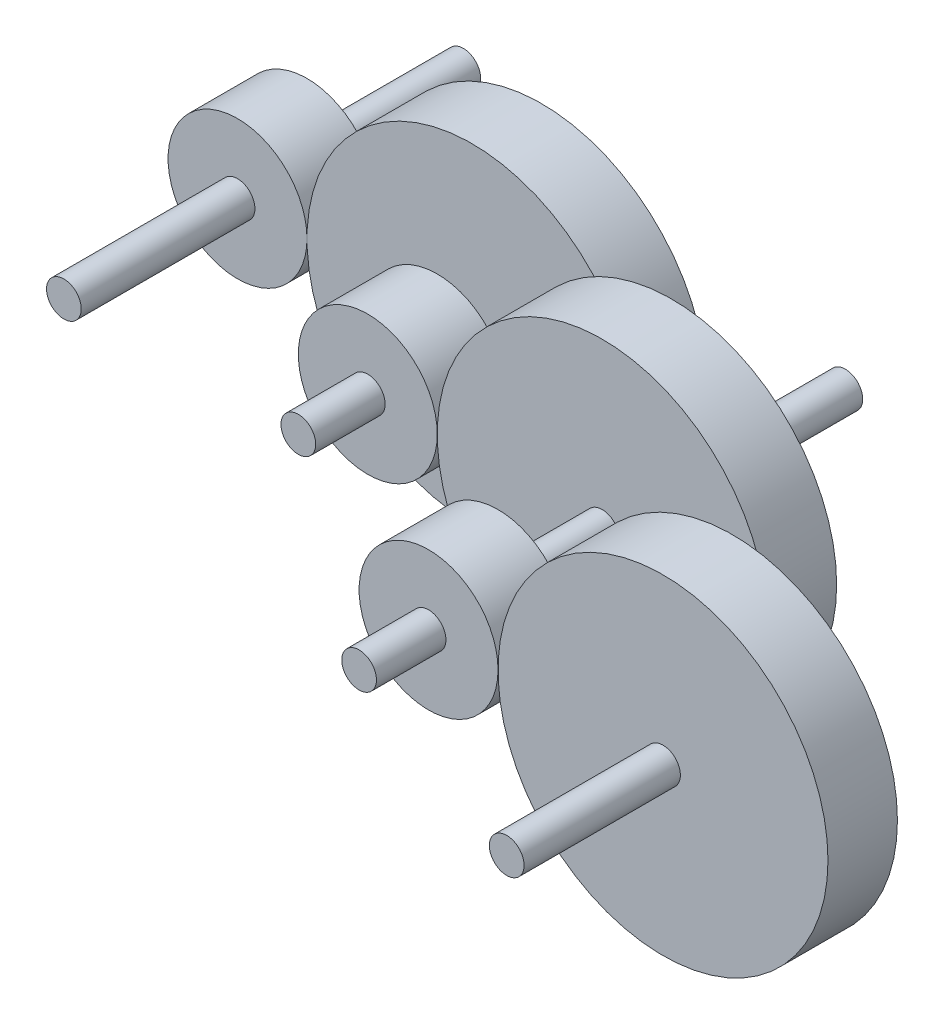
ISO-10303-21;
HEADER;
FILE_DESCRIPTION(('STEP AP214'),'2;1');
FILE_NAME('part.step','',(''),(''),'','','');
FILE_SCHEMA(('AUTOMOTIVE_DESIGN { 1 0 10303 214 1 1 1 1 }'));
ENDSEC;
DATA;
#1=APPLICATION_CONTEXT('core data for automotive mechanical design processes');
#2=APPLICATION_PROTOCOL_DEFINITION('international standard','automotive_design',2000,#1);
#3=PRODUCT_CONTEXT('',#1,'mechanical');
#4=PRODUCT('Part','Part','',(#3));
#5=PRODUCT_RELATED_PRODUCT_CATEGORY('part','',(#4));
#6=PRODUCT_DEFINITION_FORMATION('','',#4);
#7=PRODUCT_DEFINITION_CONTEXT('part definition',#1,'design');
#8=PRODUCT_DEFINITION('design','',#6,#7);
#9=PRODUCT_DEFINITION_SHAPE('','',#8);
#10=(LENGTH_UNIT() NAMED_UNIT(*) SI_UNIT(.MILLI.,.METRE.));
#11=(NAMED_UNIT(*) PLANE_ANGLE_UNIT() SI_UNIT($,.RADIAN.));
#12=(NAMED_UNIT(*) SI_UNIT($,.STERADIAN.) SOLID_ANGLE_UNIT());
#13=UNCERTAINTY_MEASURE_WITH_UNIT(LENGTH_MEASURE(1.E-05),#10,'distance_accuracy_value','');
#14=(GEOMETRIC_REPRESENTATION_CONTEXT(3) GLOBAL_UNCERTAINTY_ASSIGNED_CONTEXT((#13)) GLOBAL_UNIT_ASSIGNED_CONTEXT((#10,
#11,#12)) REPRESENTATION_CONTEXT('',''));
#15=CARTESIAN_POINT('',(0.,0.,0.));
#16=DIRECTION('',(0.,0.,1.));
#17=DIRECTION('',(1.,0.,0.));
#18=AXIS2_PLACEMENT_3D('',#15,#16,#17);
#19=CARTESIAN_POINT('',(171.45,0.,165.1));
#20=DIRECTION('',(0.,0.,-1.));
#21=DIRECTION('',(-1.,0.,0.));
#22=AXIS2_PLACEMENT_3D('',#19,#20,#21);
#23=CYLINDRICAL_SURFACE('',#22,120.650000000001);
#24=CARTESIAN_POINT('',(171.45,0.,165.1));
#25=DIRECTION('',(0.,0.,1.));
#26=DIRECTION('',(1.,0.,0.));
#27=AXIS2_PLACEMENT_3D('',#24,#25,#26);
#28=CIRCLE('',#27,120.650000000001);
#29=CARTESIAN_POINT('',(292.100000000001,0.,165.1));
#30=VERTEX_POINT('',#29);
#31=EDGE_CURVE('E91',#30,#30,#28,.T.);
#32=ORIENTED_EDGE('',*,*,#31,.F.);
#33=EDGE_LOOP('',(#32));
#34=FACE_BOUND('',#33,.T.);
#35=CARTESIAN_POINT('',(171.45,0.,114.3));
#36=DIRECTION('',(0.,0.,1.));
#37=DIRECTION('',(1.,0.,0.));
#38=AXIS2_PLACEMENT_3D('',#35,#36,#37);
#39=CIRCLE('',#38,120.650000000001);
#40=CARTESIAN_POINT('',(292.100000000001,0.,114.3));
#41=VERTEX_POINT('',#40);
#42=EDGE_CURVE('E97',#41,#41,#39,.T.);
#43=ORIENTED_EDGE('',*,*,#42,.T.);
#44=EDGE_LOOP('',(#43));
#45=FACE_BOUND('',#44,.T.);
#46=ADVANCED_FACE('F84',(#34,#45),#23,.T.);
#47=CARTESIAN_POINT('',(171.45,0.,165.1));
#48=DIRECTION('',(0.,0.,-1.));
#49=DIRECTION('',(-1.,0.,0.));
#50=AXIS2_PLACEMENT_3D('',#47,#48,#49);
#51=CYLINDRICAL_SURFACE('',#50,12.7000000000001);
#52=CARTESIAN_POINT('',(171.45,0.,165.1));
#53=DIRECTION('',(0.,0.,1.));
#54=DIRECTION('',(1.,0.,0.));
#55=AXIS2_PLACEMENT_3D('',#52,#53,#54);
#56=CIRCLE('',#55,12.7000000000001);
#57=CARTESIAN_POINT('',(184.15,0.,165.1));
#58=VERTEX_POINT('',#57);
#59=EDGE_CURVE('E12',#58,#58,#56,.T.);
#60=ORIENTED_EDGE('',*,*,#59,.T.);
#61=EDGE_LOOP('',(#60));
#62=FACE_BOUND('',#61,.T.);
#63=CARTESIAN_POINT('',(171.45,0.,114.3));
#64=DIRECTION('',(0.,0.,1.));
#65=DIRECTION('',(1.,0.,0.));
#66=AXIS2_PLACEMENT_3D('',#63,#64,#65);
#67=CIRCLE('',#66,12.7000000000001);
#68=CARTESIAN_POINT('',(184.15,0.,114.3));
#69=VERTEX_POINT('',#68);
#70=EDGE_CURVE('E87',#69,#69,#67,.T.);
#71=ORIENTED_EDGE('',*,*,#70,.F.);
#72=EDGE_LOOP('',(#71));
#73=FACE_BOUND('',#72,.T.);
#74=ADVANCED_FACE('F106',(#62,#73),#51,.F.);
#75=CARTESIAN_POINT('',(0.,0.,165.1));
#76=DIRECTION('',(0.,0.,1.));
#77=DIRECTION('',(1.,0.,0.));
#78=AXIS2_PLACEMENT_3D('',#75,#76,#77);
#79=PLANE('',#78);
#80=ORIENTED_EDGE('',*,*,#31,.T.);
#81=EDGE_LOOP('',(#80));
#82=FACE_BOUND('',#81,.T.);
#83=ORIENTED_EDGE('',*,*,#59,.F.);
#84=EDGE_LOOP('',(#83));
#85=FACE_BOUND('',#84,.T.);
#86=ADVANCED_FACE('F108',(#82,#85),#79,.T.);
#87=CARTESIAN_POINT('',(0.,0.,114.3));
#88=DIRECTION('',(0.,0.,1.));
#89=DIRECTION('',(1.,0.,0.));
#90=AXIS2_PLACEMENT_3D('',#87,#88,#89);
#91=PLANE('',#90);
#92=ORIENTED_EDGE('',*,*,#42,.F.);
#93=EDGE_LOOP('',(#92));
#94=FACE_BOUND('',#93,.T.);
#95=ORIENTED_EDGE('',*,*,#70,.T.);
#96=EDGE_LOOP('',(#95));
#97=FACE_BOUND('',#96,.T.);
#98=ADVANCED_FACE('F104',(#94,#97),#91,.F.);
#99=CLOSED_SHELL('',(#46,#74,#86,#98));
#100=MANIFOLD_SOLID_BREP('B2',#99);
#101=CARTESIAN_POINT('',(0.,0.,165.1));
#102=DIRECTION('',(0.,0.,-1.));
#103=DIRECTION('',(-1.,0.,0.));
#104=AXIS2_PLACEMENT_3D('',#101,#102,#103);
#105=CYLINDRICAL_SURFACE('',#104,50.8);
#106=CARTESIAN_POINT('',(0.,0.,165.1));
#107=DIRECTION('',(0.,0.,1.));
#108=DIRECTION('',(1.,0.,0.));
#109=AXIS2_PLACEMENT_3D('',#106,#107,#108);
#110=CIRCLE('',#109,50.8);
#111=CARTESIAN_POINT('',(50.8,0.,165.1));
#112=VERTEX_POINT('',#111);
#113=EDGE_CURVE('E212',#112,#112,#110,.T.);
#114=ORIENTED_EDGE('',*,*,#113,.F.);
#115=EDGE_LOOP('',(#114));
#116=FACE_BOUND('',#115,.T.);
#117=CARTESIAN_POINT('',(0.,0.,114.3));
#118=DIRECTION('',(0.,0.,1.));
#119=DIRECTION('',(1.,0.,0.));
#120=AXIS2_PLACEMENT_3D('',#117,#118,#119);
#121=CIRCLE('',#120,50.8);
#122=CARTESIAN_POINT('',(50.8,0.,114.3));
#123=VERTEX_POINT('',#122);
#124=EDGE_CURVE('E218',#123,#123,#121,.T.);
#125=ORIENTED_EDGE('',*,*,#124,.T.);
#126=EDGE_LOOP('',(#125));
#127=FACE_BOUND('',#126,.T.);
#128=ADVANCED_FACE('F205',(#116,#127),#105,.T.);
#129=CARTESIAN_POINT('',(0.,0.,165.1));
#130=DIRECTION('',(0.,0.,-1.));
#131=DIRECTION('',(-1.,0.,0.));
#132=AXIS2_PLACEMENT_3D('',#129,#130,#131);
#133=CYLINDRICAL_SURFACE('',#132,12.7);
#134=CARTESIAN_POINT('',(0.,0.,165.1));
#135=DIRECTION('',(0.,0.,1.));
#136=DIRECTION('',(1.,0.,0.));
#137=AXIS2_PLACEMENT_3D('',#134,#135,#136);
#138=CIRCLE('',#137,12.7);
#139=CARTESIAN_POINT('',(12.7,0.,165.1));
#140=VERTEX_POINT('',#139);
#141=EDGE_CURVE('E83',#140,#140,#138,.T.);
#142=ORIENTED_EDGE('',*,*,#141,.T.);
#143=EDGE_LOOP('',(#142));
#144=FACE_BOUND('',#143,.T.);
#145=CARTESIAN_POINT('',(0.,0.,114.3));
#146=DIRECTION('',(0.,0.,1.));
#147=DIRECTION('',(1.,0.,0.));
#148=AXIS2_PLACEMENT_3D('',#145,#146,#147);
#149=CIRCLE('',#148,12.7);
#150=CARTESIAN_POINT('',(12.7,0.,114.3));
#151=VERTEX_POINT('',#150);
#152=EDGE_CURVE('E208',#151,#151,#149,.T.);
#153=ORIENTED_EDGE('',*,*,#152,.F.);
#154=EDGE_LOOP('',(#153));
#155=FACE_BOUND('',#154,.T.);
#156=ADVANCED_FACE('F227',(#144,#155),#133,.F.);
#157=CARTESIAN_POINT('',(0.,0.,165.1));
#158=DIRECTION('',(0.,0.,1.));
#159=DIRECTION('',(1.,0.,0.));
#160=AXIS2_PLACEMENT_3D('',#157,#158,#159);
#161=PLANE('',#160);
#162=ORIENTED_EDGE('',*,*,#113,.T.);
#163=EDGE_LOOP('',(#162));
#164=FACE_BOUND('',#163,.T.);
#165=ORIENTED_EDGE('',*,*,#141,.F.);
#166=EDGE_LOOP('',(#165));
#167=FACE_BOUND('',#166,.T.);
#168=ADVANCED_FACE('F229',(#164,#167),#161,.T.);
#169=CARTESIAN_POINT('',(0.,0.,114.3));
#170=DIRECTION('',(0.,0.,1.));
#171=DIRECTION('',(1.,0.,0.));
#172=AXIS2_PLACEMENT_3D('',#169,#170,#171);
#173=PLANE('',#172);
#174=ORIENTED_EDGE('',*,*,#124,.F.);
#175=EDGE_LOOP('',(#174));
#176=FACE_BOUND('',#175,.T.);
#177=ORIENTED_EDGE('',*,*,#152,.T.);
#178=EDGE_LOOP('',(#177));
#179=FACE_BOUND('',#178,.T.);
#180=ADVANCED_FACE('F225',(#176,#179),#173,.F.);
#181=CLOSED_SHELL('',(#128,#156,#168,#180));
#182=MANIFOLD_SOLID_BREP('B7',#181);
#183=CARTESIAN_POINT('',(514.35,0.,482.6));
#184=DIRECTION('',(0.,0.,-1.));
#185=DIRECTION('',(-1.,0.,0.));
#186=AXIS2_PLACEMENT_3D('',#183,#184,#185);
#187=CYLINDRICAL_SURFACE('',#186,12.7);
#188=CARTESIAN_POINT('',(514.35,0.,266.7));
#189=DIRECTION('',(0.,0.,1.));
#190=DIRECTION('',(1.,0.,0.));
#191=AXIS2_PLACEMENT_3D('',#188,#189,#190);
#192=CIRCLE('',#191,12.7);
#193=CARTESIAN_POINT('',(527.05,0.,266.7));
#194=VERTEX_POINT('',#193);
#195=EDGE_CURVE('E331',#194,#194,#192,.T.);
#196=ORIENTED_EDGE('',*,*,#195,.T.);
#197=EDGE_LOOP('',(#196));
#198=FACE_BOUND('',#197,.T.);
#199=CARTESIAN_POINT('',(514.35,0.,317.5));
#200=DIRECTION('',(0.,0.,1.));
#201=DIRECTION('',(1.,0.,0.));
#202=AXIS2_PLACEMENT_3D('',#199,#200,#201);
#203=CIRCLE('',#202,12.7);
#204=CARTESIAN_POINT('',(527.05,0.,317.5));
#205=VERTEX_POINT('',#204);
#206=EDGE_CURVE('E204',#205,#205,#203,.T.);
#207=ORIENTED_EDGE('',*,*,#206,.F.);
#208=EDGE_LOOP('',(#207));
#209=FACE_BOUND('',#208,.T.);
#210=ADVANCED_FACE('F320',(#198,#209),#187,.T.);
#211=CARTESIAN_POINT('',(514.35,0.,266.7));
#212=DIRECTION('',(0.,0.,1.));
#213=DIRECTION('',(1.,0.,0.));
#214=AXIS2_PLACEMENT_3D('',#211,#212,#213);
#215=PLANE('',#214);
#216=ORIENTED_EDGE('',*,*,#195,.F.);
#217=EDGE_LOOP('',(#216));
#218=FACE_BOUND('',#217,.T.);
#219=ADVANCED_FACE('F365',(#218),#215,.F.);
#220=CARTESIAN_POINT('',(514.35,0.,368.3));
#221=DIRECTION('',(0.,0.,-1.));
#222=DIRECTION('',(-1.,0.,0.));
#223=AXIS2_PLACEMENT_3D('',#220,#221,#222);
#224=CYLINDRICAL_SURFACE('',#223,120.650000000001);
#225=CARTESIAN_POINT('',(514.35,0.,317.5));
#226=DIRECTION('',(0.,0.,1.));
#227=DIRECTION('',(1.,0.,0.));
#228=AXIS2_PLACEMENT_3D('',#225,#226,#227);
#229=CIRCLE('',#228,120.650000000001);
#230=CARTESIAN_POINT('',(635.000000000001,0.,317.5));
#231=VERTEX_POINT('',#230);
#232=EDGE_CURVE('E339',#231,#231,#229,.T.);
#233=ORIENTED_EDGE('',*,*,#232,.T.);
#234=EDGE_LOOP('',(#233));
#235=FACE_BOUND('',#234,.T.);
#236=CARTESIAN_POINT('',(514.35,0.,368.3));
#237=DIRECTION('',(0.,0.,1.));
#238=DIRECTION('',(1.,0.,0.));
#239=AXIS2_PLACEMENT_3D('',#236,#237,#238);
#240=CIRCLE('',#239,120.650000000001);
#241=CARTESIAN_POINT('',(635.000000000001,0.,368.3));
#242=VERTEX_POINT('',#241);
#243=EDGE_CURVE('E342',#242,#242,#240,.T.);
#244=ORIENTED_EDGE('',*,*,#243,.F.);
#245=EDGE_LOOP('',(#244));
#246=FACE_BOUND('',#245,.T.);
#247=ADVANCED_FACE('F351',(#235,#246),#224,.T.);
#248=CARTESIAN_POINT('',(0.,0.,317.5));
#249=DIRECTION('',(0.,0.,1.));
#250=DIRECTION('',(1.,0.,0.));
#251=AXIS2_PLACEMENT_3D('',#248,#249,#250);
#252=PLANE('',#251);
#253=ORIENTED_EDGE('',*,*,#206,.T.);
#254=EDGE_LOOP('',(#253));
#255=FACE_BOUND('',#254,.T.);
#256=ORIENTED_EDGE('',*,*,#232,.F.);
#257=EDGE_LOOP('',(#256));
#258=FACE_BOUND('',#257,.T.);
#259=ADVANCED_FACE('F354',(#255,#258),#252,.F.);
#260=CARTESIAN_POINT('',(0.,0.,368.3));
#261=DIRECTION('',(0.,0.,1.));
#262=DIRECTION('',(1.,0.,0.));
#263=AXIS2_PLACEMENT_3D('',#260,#261,#262);
#264=PLANE('',#263);
#265=CARTESIAN_POINT('',(514.35,0.,368.3));
#266=DIRECTION('',(0.,0.,1.));
#267=DIRECTION('',(1.,0.,0.));
#268=AXIS2_PLACEMENT_3D('',#265,#266,#267);
#269=CIRCLE('',#268,12.7);
#270=CARTESIAN_POINT('',(527.05,0.,368.3));
#271=VERTEX_POINT('',#270);
#272=EDGE_CURVE('E336',#271,#271,#269,.T.);
#273=ORIENTED_EDGE('',*,*,#272,.F.);
#274=EDGE_LOOP('',(#273));
#275=FACE_BOUND('',#274,.T.);
#276=ORIENTED_EDGE('',*,*,#243,.T.);
#277=EDGE_LOOP('',(#276));
#278=FACE_BOUND('',#277,.T.);
#279=ADVANCED_FACE('F356',(#275,#278),#264,.T.);
#280=CARTESIAN_POINT('',(514.35,0.,482.6));
#281=DIRECTION('',(0.,0.,1.));
#282=DIRECTION('',(1.,0.,0.));
#283=AXIS2_PLACEMENT_3D('',#280,#281,#282);
#284=PLANE('',#283);
#285=CARTESIAN_POINT('',(514.35,0.,482.6));
#286=DIRECTION('',(0.,0.,1.));
#287=DIRECTION('',(1.,0.,0.));
#288=AXIS2_PLACEMENT_3D('',#285,#286,#287);
#289=CIRCLE('',#288,12.7);
#290=CARTESIAN_POINT('',(527.05,0.,482.6));
#291=VERTEX_POINT('',#290);
#292=EDGE_CURVE('E327',#291,#291,#289,.T.);
#293=ORIENTED_EDGE('',*,*,#292,.T.);
#294=EDGE_LOOP('',(#293));
#295=FACE_BOUND('',#294,.T.);
#296=ADVANCED_FACE('F362',(#295),#284,.T.);
#297=ORIENTED_EDGE('',*,*,#272,.T.);
#298=EDGE_LOOP('',(#297));
#299=FACE_BOUND('',#298,.T.);
#300=ORIENTED_EDGE('',*,*,#292,.F.);
#301=EDGE_LOOP('',(#300));
#302=FACE_BOUND('',#301,.T.);
#303=ADVANCED_FACE('F322',(#299,#302),#187,.T.);
#304=CLOSED_SHELL('',(#210,#219,#247,#259,#279,#296,#303));
#305=MANIFOLD_SOLID_BREP('B78',#304);
#306=CARTESIAN_POINT('',(342.9,0.,419.1));
#307=DIRECTION('',(0.,0.,-1.));
#308=DIRECTION('',(-1.,0.,0.));
#309=AXIS2_PLACEMENT_3D('',#306,#307,#308);
#310=CYLINDRICAL_SURFACE('',#309,12.7000000000005);
#311=CARTESIAN_POINT('',(342.9,0.,241.3));
#312=DIRECTION('',(0.,0.,1.));
#313=DIRECTION('',(1.,0.,0.));
#314=AXIS2_PLACEMENT_3D('',#311,#312,#313);
#315=CIRCLE('',#314,12.7000000000005);
#316=CARTESIAN_POINT('',(355.6,0.,241.3));
#317=VERTEX_POINT('',#316);
#318=EDGE_CURVE('E522',#317,#317,#315,.T.);
#319=ORIENTED_EDGE('',*,*,#318,.T.);
#320=EDGE_LOOP('',(#319));
#321=FACE_BOUND('',#320,.T.);
#322=CARTESIAN_POINT('',(342.9,0.,317.5));
#323=DIRECTION('',(0.,0.,1.));
#324=DIRECTION('',(1.,0.,0.));
#325=AXIS2_PLACEMENT_3D('',#322,#323,#324);
#326=CIRCLE('',#325,12.7000000000005);
#327=CARTESIAN_POINT('',(355.6,0.,317.5));
#328=VERTEX_POINT('',#327);
#329=EDGE_CURVE('E319',#328,#328,#326,.T.);
#330=ORIENTED_EDGE('',*,*,#329,.F.);
#331=EDGE_LOOP('',(#330));
#332=FACE_BOUND('',#331,.T.);
#333=ADVANCED_FACE('F505',(#321,#332),#310,.T.);
#334=CARTESIAN_POINT('',(342.9,0.,241.3));
#335=DIRECTION('',(0.,0.,-1.));
#336=DIRECTION('',(-1.,0.,0.));
#337=AXIS2_PLACEMENT_3D('',#334,#335,#336);
#338=CYLINDRICAL_SURFACE('',#337,120.650000000001);
#339=CARTESIAN_POINT('',(342.9,0.,190.5));
#340=DIRECTION('',(0.,0.,1.));
#341=DIRECTION('',(1.,0.,0.));
#342=AXIS2_PLACEMENT_3D('',#339,#340,#341);
#343=CIRCLE('',#342,120.650000000001);
#344=CARTESIAN_POINT('',(463.550000000001,0.,190.5));
#345=VERTEX_POINT('',#344);
#346=EDGE_CURVE('E534',#345,#345,#343,.T.);
#347=ORIENTED_EDGE('',*,*,#346,.T.);
#348=EDGE_LOOP('',(#347));
#349=FACE_BOUND('',#348,.T.);
#350=CARTESIAN_POINT('',(342.9,0.,241.3));
#351=DIRECTION('',(0.,0.,1.));
#352=DIRECTION('',(1.,0.,0.));
#353=AXIS2_PLACEMENT_3D('',#350,#351,#352);
#354=CIRCLE('',#353,120.650000000001);
#355=CARTESIAN_POINT('',(463.550000000001,0.,241.3));
#356=VERTEX_POINT('',#355);
#357=EDGE_CURVE('E526',#356,#356,#354,.T.);
#358=ORIENTED_EDGE('',*,*,#357,.F.);
#359=EDGE_LOOP('',(#358));
#360=FACE_BOUND('',#359,.T.);
#361=ADVANCED_FACE('F574',(#349,#360),#338,.T.);
#362=CARTESIAN_POINT('',(342.9,0.,241.3));
#363=DIRECTION('',(0.,0.,1.));
#364=DIRECTION('',(1.,0.,0.));
#365=AXIS2_PLACEMENT_3D('',#362,#363,#364);
#366=PLANE('',#365);
#367=ORIENTED_EDGE('',*,*,#318,.F.);
#368=EDGE_LOOP('',(#367));
#369=FACE_BOUND('',#368,.T.);
#370=ORIENTED_EDGE('',*,*,#357,.T.);
#371=EDGE_LOOP('',(#370));
#372=FACE_BOUND('',#371,.T.);
#373=ADVANCED_FACE('F580',(#369,#372),#366,.T.);
#374=CARTESIAN_POINT('',(342.9,0.,190.5));
#375=DIRECTION('',(0.,0.,1.));
#376=DIRECTION('',(1.,0.,0.));
#377=AXIS2_PLACEMENT_3D('',#374,#375,#376);
#378=PLANE('',#377);
#379=CARTESIAN_POINT('',(342.9,0.,190.5));
#380=DIRECTION('',(0.,0.,1.));
#381=DIRECTION('',(1.,0.,0.));
#382=AXIS2_PLACEMENT_3D('',#379,#380,#381);
#383=CIRCLE('',#382,12.7000000000005);
#384=CARTESIAN_POINT('',(355.6,0.,190.5));
#385=VERTEX_POINT('',#384);
#386=EDGE_CURVE('E514',#385,#385,#383,.T.);
#387=ORIENTED_EDGE('',*,*,#386,.T.);
#388=EDGE_LOOP('',(#387));
#389=FACE_BOUND('',#388,.T.);
#390=ORIENTED_EDGE('',*,*,#346,.F.);
#391=EDGE_LOOP('',(#390));
#392=FACE_BOUND('',#391,.T.);
#393=ADVANCED_FACE('F576',(#389,#392),#378,.F.);
#394=CARTESIAN_POINT('',(342.9,0.,63.5));
#395=DIRECTION('',(0.,0.,1.));
#396=DIRECTION('',(1.,0.,0.));
#397=AXIS2_PLACEMENT_3D('',#394,#395,#396);
#398=PLANE('',#397);
#399=CARTESIAN_POINT('',(342.9,0.,63.5));
#400=DIRECTION('',(0.,0.,1.));
#401=DIRECTION('',(1.,0.,0.));
#402=AXIS2_PLACEMENT_3D('',#399,#400,#401);
#403=CIRCLE('',#402,12.7000000000005);
#404=CARTESIAN_POINT('',(355.6,0.,63.5));
#405=VERTEX_POINT('',#404);
#406=EDGE_CURVE('E525',#405,#405,#403,.T.);
#407=ORIENTED_EDGE('',*,*,#406,.F.);
#408=EDGE_LOOP('',(#407));
#409=FACE_BOUND('',#408,.T.);
#410=ADVANCED_FACE('F570',(#409),#398,.F.);
#411=ORIENTED_EDGE('',*,*,#406,.T.);
#412=EDGE_LOOP('',(#411));
#413=FACE_BOUND('',#412,.T.);
#414=ORIENTED_EDGE('',*,*,#386,.F.);
#415=EDGE_LOOP('',(#414));
#416=FACE_BOUND('',#415,.T.);
#417=ADVANCED_FACE('F565',(#413,#416),#310,.T.);
#418=CARTESIAN_POINT('',(342.9,0.,368.3));
#419=DIRECTION('',(0.,0.,-1.));
#420=DIRECTION('',(-1.,0.,0.));
#421=AXIS2_PLACEMENT_3D('',#418,#419,#420);
#422=CYLINDRICAL_SURFACE('',#421,50.8000000000007);
#423=CARTESIAN_POINT('',(342.9,0.,317.5));
#424=DIRECTION('',(0.,0.,1.));
#425=DIRECTION('',(1.,0.,0.));
#426=AXIS2_PLACEMENT_3D('',#423,#424,#425);
#427=CIRCLE('',#426,50.8000000000007);
#428=CARTESIAN_POINT('',(393.700000000001,0.,317.5));
#429=VERTEX_POINT('',#428);
#430=EDGE_CURVE('E545',#429,#429,#427,.T.);
#431=ORIENTED_EDGE('',*,*,#430,.T.);
#432=EDGE_LOOP('',(#431));
#433=FACE_BOUND('',#432,.T.);
#434=CARTESIAN_POINT('',(342.9,0.,368.3));
#435=DIRECTION('',(0.,0.,1.));
#436=DIRECTION('',(1.,0.,0.));
#437=AXIS2_PLACEMENT_3D('',#434,#435,#436);
#438=CIRCLE('',#437,50.8000000000007);
#439=CARTESIAN_POINT('',(393.700000000001,0.,368.3));
#440=VERTEX_POINT('',#439);
#441=EDGE_CURVE('E541',#440,#440,#438,.T.);
#442=ORIENTED_EDGE('',*,*,#441,.F.);
#443=EDGE_LOOP('',(#442));
#444=FACE_BOUND('',#443,.T.);
#445=ADVANCED_FACE('F560',(#433,#444),#422,.T.);
#446=CARTESIAN_POINT('',(342.9,0.,368.3));
#447=DIRECTION('',(0.,0.,1.));
#448=DIRECTION('',(1.,0.,0.));
#449=AXIS2_PLACEMENT_3D('',#446,#447,#448);
#450=PLANE('',#449);
#451=CARTESIAN_POINT('',(342.9,0.,368.3));
#452=DIRECTION('',(0.,0.,1.));
#453=DIRECTION('',(1.,0.,0.));
#454=AXIS2_PLACEMENT_3D('',#451,#452,#453);
#455=CIRCLE('',#454,12.7000000000005);
#456=CARTESIAN_POINT('',(355.6,0.,368.3));
#457=VERTEX_POINT('',#456);
#458=EDGE_CURVE('E509',#457,#457,#455,.T.);
#459=ORIENTED_EDGE('',*,*,#458,.F.);
#460=EDGE_LOOP('',(#459));
#461=FACE_BOUND('',#460,.T.);
#462=ORIENTED_EDGE('',*,*,#441,.T.);
#463=EDGE_LOOP('',(#462));
#464=FACE_BOUND('',#463,.T.);
#465=ADVANCED_FACE('F556',(#461,#464),#450,.T.);
#466=CARTESIAN_POINT('',(342.9,0.,317.5));
#467=DIRECTION('',(0.,0.,1.));
#468=DIRECTION('',(1.,0.,0.));
#469=AXIS2_PLACEMENT_3D('',#466,#467,#468);
#470=PLANE('',#469);
#471=ORIENTED_EDGE('',*,*,#329,.T.);
#472=EDGE_LOOP('',(#471));
#473=FACE_BOUND('',#472,.T.);
#474=ORIENTED_EDGE('',*,*,#430,.F.);
#475=EDGE_LOOP('',(#474));
#476=FACE_BOUND('',#475,.T.);
#477=ADVANCED_FACE('F559',(#473,#476),#470,.F.);
#478=CARTESIAN_POINT('',(342.9,0.,419.1));
#479=DIRECTION('',(0.,0.,1.));
#480=DIRECTION('',(1.,0.,0.));
#481=AXIS2_PLACEMENT_3D('',#478,#479,#480);
#482=PLANE('',#481);
#483=CARTESIAN_POINT('',(342.9,0.,419.1));
#484=DIRECTION('',(0.,0.,1.));
#485=DIRECTION('',(1.,0.,0.));
#486=AXIS2_PLACEMENT_3D('',#483,#484,#485);
#487=CIRCLE('',#486,12.7000000000005);
#488=CARTESIAN_POINT('',(355.6,0.,419.1));
#489=VERTEX_POINT('',#488);
#490=EDGE_CURVE('E519',#489,#489,#487,.T.);
#491=ORIENTED_EDGE('',*,*,#490,.T.);
#492=EDGE_LOOP('',(#491));
#493=FACE_BOUND('',#492,.T.);
#494=ADVANCED_FACE('F585',(#493),#482,.T.);
#495=ORIENTED_EDGE('',*,*,#458,.T.);
#496=EDGE_LOOP('',(#495));
#497=FACE_BOUND('',#496,.T.);
#498=ORIENTED_EDGE('',*,*,#490,.F.);
#499=EDGE_LOOP('',(#498));
#500=FACE_BOUND('',#499,.T.);
#501=ADVANCED_FACE('F507',(#497,#500),#310,.T.);
#502=CLOSED_SHELL('',(#333,#361,#373,#393,#410,#417,#445,#465,#477,#494,#501));
#503=MANIFOLD_SOLID_BREP('B199',#502);
#504=CARTESIAN_POINT('',(171.45,0.,292.1));
#505=DIRECTION('',(0.,0.,-1.));
#506=DIRECTION('',(-1.,0.,0.));
#507=AXIS2_PLACEMENT_3D('',#504,#505,#506);
#508=CYLINDRICAL_SURFACE('',#507,12.7000000000001);
#509=CARTESIAN_POINT('',(171.45,0.,241.3));
#510=DIRECTION('',(0.,0.,1.));
#511=DIRECTION('',(1.,0.,0.));
#512=AXIS2_PLACEMENT_3D('',#509,#510,#511);
#513=CIRCLE('',#512,12.7000000000001);
#514=CARTESIAN_POINT('',(184.15,0.,241.3));
#515=VERTEX_POINT('',#514);
#516=EDGE_CURVE('E759',#515,#515,#513,.T.);
#517=ORIENTED_EDGE('',*,*,#516,.T.);
#518=EDGE_LOOP('',(#517));
#519=FACE_BOUND('',#518,.T.);
#520=CARTESIAN_POINT('',(171.45,0.,292.1));
#521=DIRECTION('',(0.,0.,1.));
#522=DIRECTION('',(1.,0.,0.));
#523=AXIS2_PLACEMENT_3D('',#520,#521,#522);
#524=CIRCLE('',#523,12.7000000000001);
#525=CARTESIAN_POINT('',(184.15,0.,292.1));
#526=VERTEX_POINT('',#525);
#527=EDGE_CURVE('E763',#526,#526,#524,.T.);
#528=ORIENTED_EDGE('',*,*,#527,.F.);
#529=EDGE_LOOP('',(#528));
#530=FACE_BOUND('',#529,.T.);
#531=ADVANCED_FACE('F756',(#519,#530),#508,.T.);
#532=CARTESIAN_POINT('',(171.45,0.,292.1));
#533=DIRECTION('',(0.,0.,1.));
#534=DIRECTION('',(1.,0.,0.));
#535=AXIS2_PLACEMENT_3D('',#532,#533,#534);
#536=PLANE('',#535);
#537=ORIENTED_EDGE('',*,*,#527,.T.);
#538=EDGE_LOOP('',(#537));
#539=FACE_BOUND('',#538,.T.);
#540=ADVANCED_FACE('F793',(#539),#536,.T.);
#541=CARTESIAN_POINT('',(171.45,0.,241.3));
#542=DIRECTION('',(0.,0.,-1.));
#543=DIRECTION('',(-1.,0.,0.));
#544=AXIS2_PLACEMENT_3D('',#541,#542,#543);
#545=CYLINDRICAL_SURFACE('',#544,50.8000000000002);
#546=CARTESIAN_POINT('',(171.45,0.,190.5));
#547=DIRECTION('',(0.,0.,1.));
#548=DIRECTION('',(1.,0.,0.));
#549=AXIS2_PLACEMENT_3D('',#546,#547,#548);
#550=CIRCLE('',#549,50.8000000000002);
#551=CARTESIAN_POINT('',(222.25,0.,190.5));
#552=VERTEX_POINT('',#551);
#553=EDGE_CURVE('E775',#552,#552,#550,.T.);
#554=ORIENTED_EDGE('',*,*,#553,.T.);
#555=EDGE_LOOP('',(#554));
#556=FACE_BOUND('',#555,.T.);
#557=CARTESIAN_POINT('',(171.45,0.,241.3));
#558=DIRECTION('',(0.,0.,1.));
#559=DIRECTION('',(1.,0.,0.));
#560=AXIS2_PLACEMENT_3D('',#557,#558,#559);
#561=CIRCLE('',#560,50.8000000000002);
#562=CARTESIAN_POINT('',(222.25,0.,241.3));
#563=VERTEX_POINT('',#562);
#564=EDGE_CURVE('E772',#563,#563,#561,.T.);
#565=ORIENTED_EDGE('',*,*,#564,.F.);
#566=EDGE_LOOP('',(#565));
#567=FACE_BOUND('',#566,.T.);
#568=ADVANCED_FACE('F788',(#556,#567),#545,.T.);
#569=CARTESIAN_POINT('',(171.45,0.,241.3));
#570=DIRECTION('',(0.,0.,1.));
#571=DIRECTION('',(1.,0.,0.));
#572=AXIS2_PLACEMENT_3D('',#569,#570,#571);
#573=PLANE('',#572);
#574=ORIENTED_EDGE('',*,*,#516,.F.);
#575=EDGE_LOOP('',(#574));
#576=FACE_BOUND('',#575,.T.);
#577=ORIENTED_EDGE('',*,*,#564,.T.);
#578=EDGE_LOOP('',(#577));
#579=FACE_BOUND('',#578,.T.);
#580=ADVANCED_FACE('F784',(#576,#579),#573,.T.);
#581=CARTESIAN_POINT('',(171.45,0.,190.5));
#582=DIRECTION('',(0.,0.,1.));
#583=DIRECTION('',(1.,0.,0.));
#584=AXIS2_PLACEMENT_3D('',#581,#582,#583);
#585=PLANE('',#584);
#586=CARTESIAN_POINT('',(171.45,0.,190.5));
#587=DIRECTION('',(0.,0.,1.));
#588=DIRECTION('',(1.,0.,0.));
#589=AXIS2_PLACEMENT_3D('',#586,#587,#588);
#590=CIRCLE('',#589,12.7000000000001);
#591=CARTESIAN_POINT('',(184.15,0.,190.5));
#592=VERTEX_POINT('',#591);
#593=EDGE_CURVE('E504',#592,#592,#590,.T.);
#594=ORIENTED_EDGE('',*,*,#593,.T.);
#595=EDGE_LOOP('',(#594));
#596=FACE_BOUND('',#595,.T.);
#597=ORIENTED_EDGE('',*,*,#553,.F.);
#598=EDGE_LOOP('',(#597));
#599=FACE_BOUND('',#598,.T.);
#600=ADVANCED_FACE('F787',(#596,#599),#585,.F.);
#601=CARTESIAN_POINT('',(171.45,0.,63.5));
#602=DIRECTION('',(0.,0.,1.));
#603=DIRECTION('',(1.,0.,0.));
#604=AXIS2_PLACEMENT_3D('',#601,#602,#603);
#605=PLANE('',#604);
#606=CARTESIAN_POINT('',(171.45,0.,63.5));
#607=DIRECTION('',(0.,0.,1.));
#608=DIRECTION('',(1.,0.,0.));
#609=AXIS2_PLACEMENT_3D('',#606,#607,#608);
#610=CIRCLE('',#609,12.7000000000001);
#611=CARTESIAN_POINT('',(184.15,0.,63.5));
#612=VERTEX_POINT('',#611);
#613=EDGE_CURVE('E767',#612,#612,#610,.T.);
#614=ORIENTED_EDGE('',*,*,#613,.F.);
#615=EDGE_LOOP('',(#614));
#616=FACE_BOUND('',#615,.T.);
#617=ADVANCED_FACE('F806',(#616),#605,.F.);
#618=ORIENTED_EDGE('',*,*,#613,.T.);
#619=EDGE_LOOP('',(#618));
#620=FACE_BOUND('',#619,.T.);
#621=ORIENTED_EDGE('',*,*,#593,.F.);
#622=EDGE_LOOP('',(#621));
#623=FACE_BOUND('',#622,.T.);
#624=ADVANCED_FACE('F802',(#620,#623),#508,.T.);
#625=CLOSED_SHELL('',(#531,#540,#568,#580,#600,#617,#624));
#626=MANIFOLD_SOLID_BREP('B314',#625);
#627=CARTESIAN_POINT('',(0.,0.,292.1));
#628=DIRECTION('',(0.,0.,-1.));
#629=DIRECTION('',(-1.,0.,0.));
#630=AXIS2_PLACEMENT_3D('',#627,#628,#629);
#631=CYLINDRICAL_SURFACE('',#630,12.7);
#632=CARTESIAN_POINT('',(0.,0.,292.1));
#633=DIRECTION('',(0.,0.,1.));
#634=DIRECTION('',(1.,0.,0.));
#635=AXIS2_PLACEMENT_3D('',#632,#633,#634);
#636=CIRCLE('',#635,12.7);
#637=CARTESIAN_POINT('',(12.7,0.,292.1));
#638=VERTEX_POINT('',#637);
#639=EDGE_CURVE('E755',#638,#638,#636,.T.);
#640=ORIENTED_EDGE('',*,*,#639,.F.);
#641=EDGE_LOOP('',(#640));
#642=FACE_BOUND('',#641,.T.);
#643=CARTESIAN_POINT('',(0.,0.,0.));
#644=DIRECTION('',(0.,0.,1.));
#645=DIRECTION('',(1.,0.,0.));
#646=AXIS2_PLACEMENT_3D('',#643,#644,#645);
#647=CIRCLE('',#646,12.7);
#648=CARTESIAN_POINT('',(12.7,0.,0.));
#649=VERTEX_POINT('',#648);
#650=EDGE_CURVE('E897',#649,#649,#647,.T.);
#651=ORIENTED_EDGE('',*,*,#650,.T.);
#652=EDGE_LOOP('',(#651));
#653=FACE_BOUND('',#652,.T.);
#654=ADVANCED_FACE('F894',(#642,#653),#631,.T.);
#655=CARTESIAN_POINT('',(0.,0.,292.1));
#656=DIRECTION('',(0.,0.,1.));
#657=DIRECTION('',(1.,0.,0.));
#658=AXIS2_PLACEMENT_3D('',#655,#656,#657);
#659=PLANE('',#658);
#660=ORIENTED_EDGE('',*,*,#639,.T.);
#661=EDGE_LOOP('',(#660));
#662=FACE_BOUND('',#661,.T.);
#663=ADVANCED_FACE('F909',(#662),#659,.T.);
#664=CARTESIAN_POINT('',(0.,0.,0.));
#665=DIRECTION('',(0.,0.,1.));
#666=DIRECTION('',(1.,0.,0.));
#667=AXIS2_PLACEMENT_3D('',#664,#665,#666);
#668=PLANE('',#667);
#669=ORIENTED_EDGE('',*,*,#650,.F.);
#670=EDGE_LOOP('',(#669));
#671=FACE_BOUND('',#670,.T.);
#672=ADVANCED_FACE('F907',(#671),#668,.F.);
#673=CLOSED_SHELL('',(#654,#663,#672));
#674=MANIFOLD_SOLID_BREP('B499',#673);
#675=ADVANCED_BREP_SHAPE_REPRESENTATION('',(#18,#100,#182,#305,#503,#626,#674),#14);
#676=SHAPE_DEFINITION_REPRESENTATION(#9,#675);
ENDSEC;
END-ISO-10303-21;
